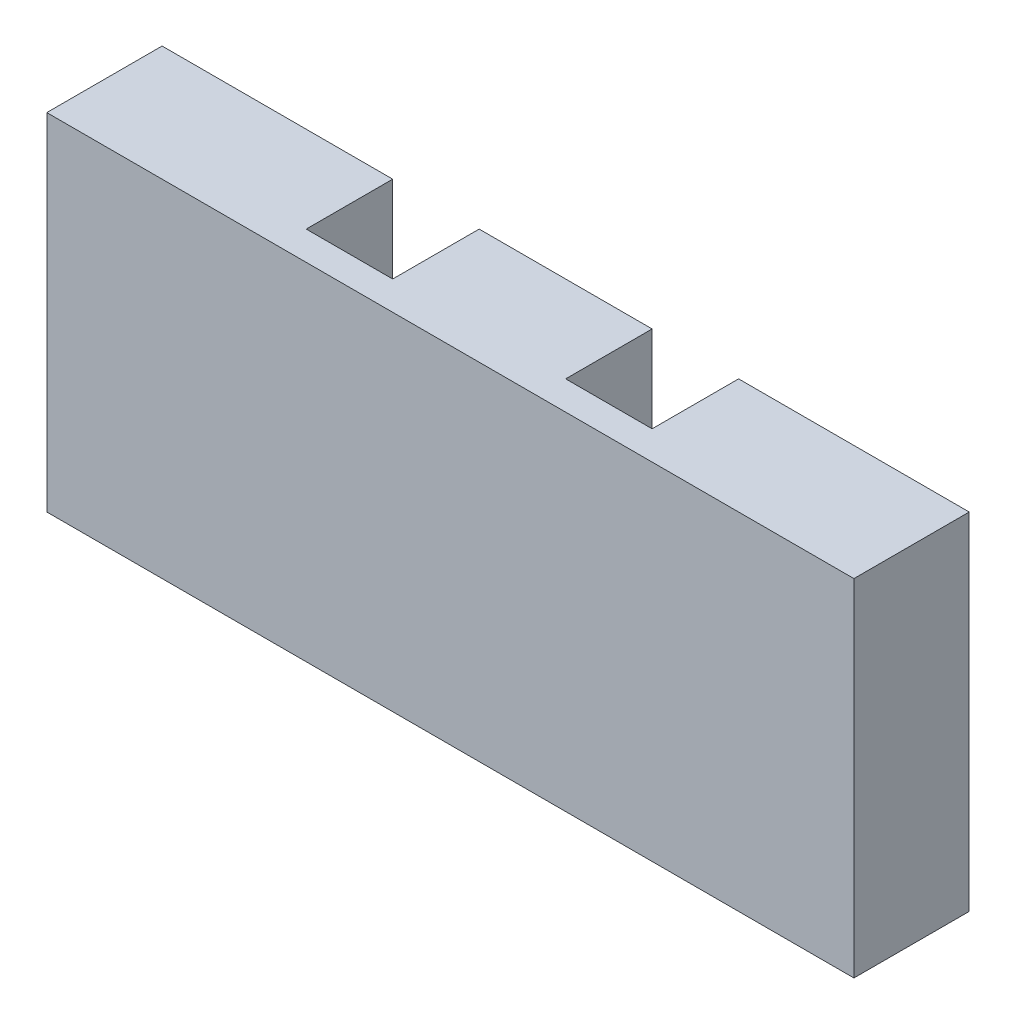
ISO-10303-21;
HEADER;
FILE_DESCRIPTION(('STEP AP214'),'2;1');
FILE_NAME('part.step','',(''),(''),'','','');
FILE_SCHEMA(('AUTOMOTIVE_DESIGN { 1 0 10303 214 1 1 1 1 }'));
ENDSEC;
DATA;
#1=APPLICATION_CONTEXT('core data for automotive mechanical design processes');
#2=APPLICATION_PROTOCOL_DEFINITION('international standard','automotive_design',2000,#1);
#3=PRODUCT_CONTEXT('',#1,'mechanical');
#4=PRODUCT('Part','Part','',(#3));
#5=PRODUCT_RELATED_PRODUCT_CATEGORY('part','',(#4));
#6=PRODUCT_DEFINITION_FORMATION('','',#4);
#7=PRODUCT_DEFINITION_CONTEXT('part definition',#1,'design');
#8=PRODUCT_DEFINITION('design','',#6,#7);
#9=PRODUCT_DEFINITION_SHAPE('','',#8);
#10=(LENGTH_UNIT() NAMED_UNIT(*) SI_UNIT(.MILLI.,.METRE.));
#11=(NAMED_UNIT(*) PLANE_ANGLE_UNIT() SI_UNIT($,.RADIAN.));
#12=(NAMED_UNIT(*) SI_UNIT($,.STERADIAN.) SOLID_ANGLE_UNIT());
#13=UNCERTAINTY_MEASURE_WITH_UNIT(LENGTH_MEASURE(1.E-05),#10,'distance_accuracy_value','');
#14=(GEOMETRIC_REPRESENTATION_CONTEXT(3) GLOBAL_UNCERTAINTY_ASSIGNED_CONTEXT((#13)) GLOBAL_UNIT_ASSIGNED_CONTEXT((#10,
#11,#12)) REPRESENTATION_CONTEXT('',''));
#15=CARTESIAN_POINT('',(0.,0.,0.));
#16=DIRECTION('',(0.,0.,1.));
#17=DIRECTION('',(1.,0.,0.));
#18=AXIS2_PLACEMENT_3D('',#15,#16,#17);
#19=CARTESIAN_POINT('',(0.,0.,0.));
#20=DIRECTION('',(0.,0.,1.));
#21=DIRECTION('',(1.,0.,0.));
#22=AXIS2_PLACEMENT_3D('',#19,#20,#21);
#23=PLANE('',#22);
#24=DIRECTION('',(0.,-1.,0.));
#25=VECTOR('',#24,1.);
#26=CARTESIAN_POINT('',(-60.,60.,0.));
#27=LINE('',#26,#25);
#28=CARTESIAN_POINT('',(-60.,60.,0.));
#29=VERTEX_POINT('',#28);
#30=CARTESIAN_POINT('',(-60.,-60.,0.));
#31=VERTEX_POINT('',#30);
#32=EDGE_CURVE('E136',#29,#31,#27,.T.);
#33=ORIENTED_EDGE('',*,*,#32,.F.);
#34=DIRECTION('',(-1.,0.,0.));
#35=VECTOR('',#34,1.);
#36=CARTESIAN_POINT('',(-140.,60.,0.));
#37=LINE('',#36,#35);
#38=CARTESIAN_POINT('',(-30.,60.,0.));
#39=VERTEX_POINT('',#38);
#40=EDGE_CURVE('E144',#39,#29,#37,.T.);
#41=ORIENTED_EDGE('',*,*,#40,.F.);
#42=DIRECTION('',(0.,1.,0.));
#43=VECTOR('',#42,1.);
#44=CARTESIAN_POINT('',(-30.,10.,0.));
#45=LINE('',#44,#43);
#46=CARTESIAN_POINT('',(-30.,10.,0.));
#47=VERTEX_POINT('',#46);
#48=EDGE_CURVE('E67',#47,#39,#45,.T.);
#49=ORIENTED_EDGE('',*,*,#48,.F.);
#50=DIRECTION('',(-1.,0.,0.));
#51=VECTOR('',#50,1.);
#52=CARTESIAN_POINT('',(30.,10.,0.));
#53=LINE('',#52,#51);
#54=CARTESIAN_POINT('',(30.,10.,0.));
#55=VERTEX_POINT('',#54);
#56=EDGE_CURVE('E223',#55,#47,#53,.T.);
#57=ORIENTED_EDGE('',*,*,#56,.F.);
#58=DIRECTION('',(0.,-1.,0.));
#59=VECTOR('',#58,1.);
#60=CARTESIAN_POINT('',(30.,10.,0.));
#61=LINE('',#60,#59);
#62=CARTESIAN_POINT('',(30.,60.,0.));
#63=VERTEX_POINT('',#62);
#64=EDGE_CURVE('E235',#63,#55,#61,.T.);
#65=ORIENTED_EDGE('',*,*,#64,.F.);
#66=CARTESIAN_POINT('',(60.,60.,0.));
#67=VERTEX_POINT('',#66);
#68=EDGE_CURVE('E156',#67,#63,#37,.T.);
#69=ORIENTED_EDGE('',*,*,#68,.F.);
#70=DIRECTION('',(0.,1.,0.));
#71=VECTOR('',#70,1.);
#72=CARTESIAN_POINT('',(60.,60.,0.));
#73=LINE('',#72,#71);
#74=CARTESIAN_POINT('',(60.,-60.,0.));
#75=VERTEX_POINT('',#74);
#76=EDGE_CURVE('E149',#75,#67,#73,.T.);
#77=ORIENTED_EDGE('',*,*,#76,.F.);
#78=DIRECTION('',(1.,0.,0.));
#79=VECTOR('',#78,1.);
#80=CARTESIAN_POINT('',(-140.,-60.,0.));
#81=LINE('',#80,#79);
#82=EDGE_CURVE('E147',#31,#75,#81,.T.);
#83=ORIENTED_EDGE('',*,*,#82,.F.);
#84=EDGE_LOOP('',(#33,#41,#49,#57,#65,#69,#77,#83));
#85=FACE_BOUND('',#84,.T.);
#86=ADVANCED_FACE('F43',(#85),#23,.F.);
#87=CARTESIAN_POINT('',(140.,60.,10.));
#88=DIRECTION('',(-1.,0.,0.));
#89=DIRECTION('',(0.,-1.,0.));
#90=AXIS2_PLACEMENT_3D('',#87,#88,#89);
#91=PLANE('',#90);
#92=DIRECTION('',(0.,0.,-1.));
#93=VECTOR('',#92,1.);
#94=CARTESIAN_POINT('',(140.,-60.,10.));
#95=LINE('',#94,#93);
#96=CARTESIAN_POINT('',(140.,-60.,10.));
#97=VERTEX_POINT('',#96);
#98=CARTESIAN_POINT('',(140.,-60.,-30.));
#99=VERTEX_POINT('',#98);
#100=EDGE_CURVE('E169',#97,#99,#95,.T.);
#101=ORIENTED_EDGE('',*,*,#100,.T.);
#102=DIRECTION('',(0.,-1.,0.));
#103=VECTOR('',#102,1.);
#104=CARTESIAN_POINT('',(140.,60.,-30.));
#105=LINE('',#104,#103);
#106=CARTESIAN_POINT('',(140.,60.,-30.));
#107=VERTEX_POINT('',#106);
#108=EDGE_CURVE('E194',#107,#99,#105,.T.);
#109=ORIENTED_EDGE('',*,*,#108,.F.);
#110=DIRECTION('',(0.,0.,-1.));
#111=VECTOR('',#110,1.);
#112=CARTESIAN_POINT('',(140.,60.,10.));
#113=LINE('',#112,#111);
#114=CARTESIAN_POINT('',(140.,60.,10.));
#115=VERTEX_POINT('',#114);
#116=EDGE_CURVE('E11',#115,#107,#113,.T.);
#117=ORIENTED_EDGE('',*,*,#116,.F.);
#118=DIRECTION('',(0.,1.,0.));
#119=VECTOR('',#118,1.);
#120=CARTESIAN_POINT('',(140.,60.,10.));
#121=LINE('',#120,#119);
#122=EDGE_CURVE('E168',#97,#115,#121,.T.);
#123=ORIENTED_EDGE('',*,*,#122,.F.);
#124=EDGE_LOOP('',(#101,#109,#117,#123));
#125=FACE_BOUND('',#124,.T.);
#126=ADVANCED_FACE('F45',(#125),#91,.F.);
#127=CARTESIAN_POINT('',(-140.,60.,10.));
#128=DIRECTION('',(0.,-1.,0.));
#129=DIRECTION('',(0.,0.,-1.));
#130=AXIS2_PLACEMENT_3D('',#127,#128,#129);
#131=PLANE('',#130);
#132=ORIENTED_EDGE('',*,*,#116,.T.);
#133=DIRECTION('',(1.,0.,0.));
#134=VECTOR('',#133,1.);
#135=CARTESIAN_POINT('',(140.,60.,-30.));
#136=LINE('',#135,#134);
#137=CARTESIAN_POINT('',(60.,60.,-30.));
#138=VERTEX_POINT('',#137);
#139=EDGE_CURVE('E204',#138,#107,#136,.T.);
#140=ORIENTED_EDGE('',*,*,#139,.F.);
#141=DIRECTION('',(0.,0.,1.));
#142=VECTOR('',#141,1.);
#143=CARTESIAN_POINT('',(60.,60.,-30.));
#144=LINE('',#143,#142);
#145=EDGE_CURVE('E208',#138,#67,#144,.T.);
#146=ORIENTED_EDGE('',*,*,#145,.T.);
#147=ORIENTED_EDGE('',*,*,#68,.T.);
#148=DIRECTION('',(0.,0.,1.));
#149=VECTOR('',#148,1.);
#150=CARTESIAN_POINT('',(30.,60.,-30.));
#151=LINE('',#150,#149);
#152=CARTESIAN_POINT('',(30.,60.,-30.));
#153=VERTEX_POINT('',#152);
#154=EDGE_CURVE('E160',#153,#63,#151,.T.);
#155=ORIENTED_EDGE('',*,*,#154,.F.);
#156=DIRECTION('',(1.,0.,0.));
#157=VECTOR('',#156,1.);
#158=CARTESIAN_POINT('',(30.,60.,-30.));
#159=LINE('',#158,#157);
#160=CARTESIAN_POINT('',(-30.,60.,-30.));
#161=VERTEX_POINT('',#160);
#162=EDGE_CURVE('E222',#161,#153,#159,.T.);
#163=ORIENTED_EDGE('',*,*,#162,.F.);
#164=DIRECTION('',(0.,0.,1.));
#165=VECTOR('',#164,1.);
#166=CARTESIAN_POINT('',(-30.,60.,-30.));
#167=LINE('',#166,#165);
#168=EDGE_CURVE('E154',#161,#39,#167,.T.);
#169=ORIENTED_EDGE('',*,*,#168,.T.);
#170=ORIENTED_EDGE('',*,*,#40,.T.);
#171=DIRECTION('',(0.,0.,1.));
#172=VECTOR('',#171,1.);
#173=CARTESIAN_POINT('',(-60.,60.,-30.));
#174=LINE('',#173,#172);
#175=CARTESIAN_POINT('',(-60.,60.,-30.));
#176=VERTEX_POINT('',#175);
#177=EDGE_CURVE('E133',#176,#29,#174,.T.);
#178=ORIENTED_EDGE('',*,*,#177,.F.);
#179=DIRECTION('',(1.,0.,0.));
#180=VECTOR('',#179,1.);
#181=CARTESIAN_POINT('',(-140.,60.,-30.));
#182=LINE('',#181,#180);
#183=CARTESIAN_POINT('',(-140.,60.,-30.));
#184=VERTEX_POINT('',#183);
#185=EDGE_CURVE('E183',#184,#176,#182,.T.);
#186=ORIENTED_EDGE('',*,*,#185,.F.);
#187=DIRECTION('',(0.,0.,-1.));
#188=VECTOR('',#187,1.);
#189=CARTESIAN_POINT('',(-140.,60.,10.));
#190=LINE('',#189,#188);
#191=CARTESIAN_POINT('',(-140.,60.,10.));
#192=VERTEX_POINT('',#191);
#193=EDGE_CURVE('E52',#192,#184,#190,.T.);
#194=ORIENTED_EDGE('',*,*,#193,.F.);
#195=DIRECTION('',(-1.,0.,0.));
#196=VECTOR('',#195,1.);
#197=CARTESIAN_POINT('',(-140.,60.,10.));
#198=LINE('',#197,#196);
#199=EDGE_CURVE('E254',#115,#192,#198,.T.);
#200=ORIENTED_EDGE('',*,*,#199,.F.);
#201=EDGE_LOOP('',(#132,#140,#146,#147,#155,#163,#169,#170,#178,#186,#194,#200));
#202=FACE_BOUND('',#201,.T.);
#203=ADVANCED_FACE('F152',(#202),#131,.F.);
#204=CARTESIAN_POINT('',(-140.,60.,10.));
#205=DIRECTION('',(1.,0.,0.));
#206=DIRECTION('',(0.,1.,0.));
#207=AXIS2_PLACEMENT_3D('',#204,#205,#206);
#208=PLANE('',#207);
#209=ORIENTED_EDGE('',*,*,#193,.T.);
#210=DIRECTION('',(0.,1.,0.));
#211=VECTOR('',#210,1.);
#212=CARTESIAN_POINT('',(-140.,60.,-30.));
#213=LINE('',#212,#211);
#214=CARTESIAN_POINT('',(-140.,-60.,-30.));
#215=VERTEX_POINT('',#214);
#216=EDGE_CURVE('E150',#215,#184,#213,.T.);
#217=ORIENTED_EDGE('',*,*,#216,.F.);
#218=DIRECTION('',(0.,0.,-1.));
#219=VECTOR('',#218,1.);
#220=CARTESIAN_POINT('',(-140.,-60.,10.));
#221=LINE('',#220,#219);
#222=CARTESIAN_POINT('',(-140.,-60.,10.));
#223=VERTEX_POINT('',#222);
#224=EDGE_CURVE('E172',#223,#215,#221,.T.);
#225=ORIENTED_EDGE('',*,*,#224,.F.);
#226=DIRECTION('',(0.,-1.,0.));
#227=VECTOR('',#226,1.);
#228=CARTESIAN_POINT('',(-140.,60.,10.));
#229=LINE('',#228,#227);
#230=EDGE_CURVE('E182',#192,#223,#229,.T.);
#231=ORIENTED_EDGE('',*,*,#230,.F.);
#232=EDGE_LOOP('',(#209,#217,#225,#231));
#233=FACE_BOUND('',#232,.T.);
#234=ADVANCED_FACE('F179',(#233),#208,.F.);
#235=CARTESIAN_POINT('',(-140.,-60.,10.));
#236=DIRECTION('',(0.,1.,0.));
#237=DIRECTION('',(0.,0.,1.));
#238=AXIS2_PLACEMENT_3D('',#235,#236,#237);
#239=PLANE('',#238);
#240=ORIENTED_EDGE('',*,*,#224,.T.);
#241=DIRECTION('',(-1.,0.,0.));
#242=VECTOR('',#241,1.);
#243=CARTESIAN_POINT('',(-140.,-60.,-30.));
#244=LINE('',#243,#242);
#245=CARTESIAN_POINT('',(-60.0000000000001,-60.,-30.));
#246=VERTEX_POINT('',#245);
#247=EDGE_CURVE('E189',#246,#215,#244,.T.);
#248=ORIENTED_EDGE('',*,*,#247,.F.);
#249=DIRECTION('',(0.,0.,1.));
#250=VECTOR('',#249,1.);
#251=CARTESIAN_POINT('',(-60.0000000000001,-60.,-30.));
#252=LINE('',#251,#250);
#253=EDGE_CURVE('E59',#246,#31,#252,.T.);
#254=ORIENTED_EDGE('',*,*,#253,.T.);
#255=ORIENTED_EDGE('',*,*,#82,.T.);
#256=DIRECTION('',(0.,0.,1.));
#257=VECTOR('',#256,1.);
#258=CARTESIAN_POINT('',(60.,-60.,-30.));
#259=LINE('',#258,#257);
#260=CARTESIAN_POINT('',(60.,-60.,-30.));
#261=VERTEX_POINT('',#260);
#262=EDGE_CURVE('E214',#261,#75,#259,.T.);
#263=ORIENTED_EDGE('',*,*,#262,.F.);
#264=DIRECTION('',(-1.,0.,0.));
#265=VECTOR('',#264,1.);
#266=CARTESIAN_POINT('',(140.,-60.,-30.));
#267=LINE('',#266,#265);
#268=EDGE_CURVE('E198',#99,#261,#267,.T.);
#269=ORIENTED_EDGE('',*,*,#268,.F.);
#270=ORIENTED_EDGE('',*,*,#100,.F.);
#271=DIRECTION('',(1.,0.,0.));
#272=VECTOR('',#271,1.);
#273=CARTESIAN_POINT('',(-140.,-60.,10.));
#274=LINE('',#273,#272);
#275=EDGE_CURVE('E164',#223,#97,#274,.T.);
#276=ORIENTED_EDGE('',*,*,#275,.F.);
#277=EDGE_LOOP('',(#240,#248,#254,#255,#263,#269,#270,#276));
#278=FACE_BOUND('',#277,.T.);
#279=ADVANCED_FACE('F265',(#278),#239,.F.);
#280=CARTESIAN_POINT('',(0.,0.,10.));
#281=DIRECTION('',(0.,0.,1.));
#282=DIRECTION('',(1.,0.,0.));
#283=AXIS2_PLACEMENT_3D('',#280,#281,#282);
#284=PLANE('',#283);
#285=ORIENTED_EDGE('',*,*,#122,.T.);
#286=ORIENTED_EDGE('',*,*,#199,.T.);
#287=ORIENTED_EDGE('',*,*,#230,.T.);
#288=ORIENTED_EDGE('',*,*,#275,.T.);
#289=EDGE_LOOP('',(#285,#286,#287,#288));
#290=FACE_BOUND('',#289,.T.);
#291=ADVANCED_FACE('F261',(#290),#284,.T.);
#292=CARTESIAN_POINT('',(-30.,10.,-30.));
#293=DIRECTION('',(1.,0.,0.));
#294=DIRECTION('',(0.,0.,-1.));
#295=AXIS2_PLACEMENT_3D('',#292,#293,#294);
#296=PLANE('',#295);
#297=ORIENTED_EDGE('',*,*,#48,.T.);
#298=ORIENTED_EDGE('',*,*,#168,.F.);
#299=DIRECTION('',(0.,1.,0.));
#300=VECTOR('',#299,1.);
#301=CARTESIAN_POINT('',(-30.,10.,-30.));
#302=LINE('',#301,#300);
#303=CARTESIAN_POINT('',(-30.,10.,-30.));
#304=VERTEX_POINT('',#303);
#305=EDGE_CURVE('E218',#304,#161,#302,.T.);
#306=ORIENTED_EDGE('',*,*,#305,.F.);
#307=DIRECTION('',(0.,0.,1.));
#308=VECTOR('',#307,1.);
#309=CARTESIAN_POINT('',(-30.,10.,-30.));
#310=LINE('',#309,#308);
#311=EDGE_CURVE('E232',#304,#47,#310,.T.);
#312=ORIENTED_EDGE('',*,*,#311,.T.);
#313=EDGE_LOOP('',(#297,#298,#306,#312));
#314=FACE_BOUND('',#313,.T.);
#315=ADVANCED_FACE('F289',(#314),#296,.F.);
#316=CARTESIAN_POINT('',(30.,10.,-30.));
#317=DIRECTION('',(-1.,0.,0.));
#318=DIRECTION('',(0.,0.,1.));
#319=AXIS2_PLACEMENT_3D('',#316,#317,#318);
#320=PLANE('',#319);
#321=ORIENTED_EDGE('',*,*,#64,.T.);
#322=DIRECTION('',(0.,0.,1.));
#323=VECTOR('',#322,1.);
#324=CARTESIAN_POINT('',(30.,10.,-30.));
#325=LINE('',#324,#323);
#326=CARTESIAN_POINT('',(30.,10.,-30.));
#327=VERTEX_POINT('',#326);
#328=EDGE_CURVE('E244',#327,#55,#325,.T.);
#329=ORIENTED_EDGE('',*,*,#328,.F.);
#330=DIRECTION('',(0.,-1.,0.));
#331=VECTOR('',#330,1.);
#332=CARTESIAN_POINT('',(30.,10.,-30.));
#333=LINE('',#332,#331);
#334=EDGE_CURVE('E226',#153,#327,#333,.T.);
#335=ORIENTED_EDGE('',*,*,#334,.F.);
#336=ORIENTED_EDGE('',*,*,#154,.T.);
#337=EDGE_LOOP('',(#321,#329,#335,#336));
#338=FACE_BOUND('',#337,.T.);
#339=ADVANCED_FACE('F282',(#338),#320,.F.);
#340=CARTESIAN_POINT('',(30.,10.,-30.));
#341=DIRECTION('',(0.,1.,0.));
#342=DIRECTION('',(0.,0.,1.));
#343=AXIS2_PLACEMENT_3D('',#340,#341,#342);
#344=PLANE('',#343);
#345=ORIENTED_EDGE('',*,*,#56,.T.);
#346=ORIENTED_EDGE('',*,*,#311,.F.);
#347=DIRECTION('',(-1.,0.,0.));
#348=VECTOR('',#347,1.);
#349=CARTESIAN_POINT('',(30.,10.,-30.));
#350=LINE('',#349,#348);
#351=EDGE_CURVE('E229',#327,#304,#350,.T.);
#352=ORIENTED_EDGE('',*,*,#351,.F.);
#353=ORIENTED_EDGE('',*,*,#328,.T.);
#354=EDGE_LOOP('',(#345,#346,#352,#353));
#355=FACE_BOUND('',#354,.T.);
#356=ADVANCED_FACE('F291',(#355),#344,.F.);
#357=CARTESIAN_POINT('',(0.,0.,-30.));
#358=DIRECTION('',(0.,0.,1.));
#359=DIRECTION('',(1.,0.,0.));
#360=AXIS2_PLACEMENT_3D('',#357,#358,#359);
#361=PLANE('',#360);
#362=ORIENTED_EDGE('',*,*,#305,.T.);
#363=ORIENTED_EDGE('',*,*,#162,.T.);
#364=ORIENTED_EDGE('',*,*,#334,.T.);
#365=ORIENTED_EDGE('',*,*,#351,.T.);
#366=EDGE_LOOP('',(#362,#363,#364,#365));
#367=FACE_BOUND('',#366,.T.);
#368=ADVANCED_FACE('F285',(#367),#361,.F.);
#369=CARTESIAN_POINT('',(60.,60.,-30.));
#370=DIRECTION('',(1.,0.,0.));
#371=DIRECTION('',(0.,1.,0.));
#372=AXIS2_PLACEMENT_3D('',#369,#370,#371);
#373=PLANE('',#372);
#374=ORIENTED_EDGE('',*,*,#76,.T.);
#375=ORIENTED_EDGE('',*,*,#145,.F.);
#376=DIRECTION('',(0.,1.,0.));
#377=VECTOR('',#376,1.);
#378=CARTESIAN_POINT('',(60.,60.,-30.));
#379=LINE('',#378,#377);
#380=EDGE_CURVE('E201',#261,#138,#379,.T.);
#381=ORIENTED_EDGE('',*,*,#380,.F.);
#382=ORIENTED_EDGE('',*,*,#262,.T.);
#383=EDGE_LOOP('',(#374,#375,#381,#382));
#384=FACE_BOUND('',#383,.T.);
#385=ADVANCED_FACE('F275',(#384),#373,.F.);
#386=CARTESIAN_POINT('',(0.,0.,-30.));
#387=DIRECTION('',(0.,0.,-1.));
#388=DIRECTION('',(-1.,0.,0.));
#389=AXIS2_PLACEMENT_3D('',#386,#387,#388);
#390=PLANE('',#389);
#391=ORIENTED_EDGE('',*,*,#108,.T.);
#392=ORIENTED_EDGE('',*,*,#268,.T.);
#393=ORIENTED_EDGE('',*,*,#380,.T.);
#394=ORIENTED_EDGE('',*,*,#139,.T.);
#395=EDGE_LOOP('',(#391,#392,#393,#394));
#396=FACE_BOUND('',#395,.T.);
#397=ADVANCED_FACE('F271',(#396),#390,.T.);
#398=CARTESIAN_POINT('',(-60.,60.,-30.));
#399=DIRECTION('',(-1.,0.,0.));
#400=DIRECTION('',(0.,-1.,0.));
#401=AXIS2_PLACEMENT_3D('',#398,#399,#400);
#402=PLANE('',#401);
#403=ORIENTED_EDGE('',*,*,#32,.T.);
#404=ORIENTED_EDGE('',*,*,#253,.F.);
#405=DIRECTION('',(0.,-1.,0.));
#406=VECTOR('',#405,1.);
#407=CARTESIAN_POINT('',(-60.,60.,-30.));
#408=LINE('',#407,#406);
#409=EDGE_CURVE('E138',#176,#246,#408,.T.);
#410=ORIENTED_EDGE('',*,*,#409,.F.);
#411=ORIENTED_EDGE('',*,*,#177,.T.);
#412=EDGE_LOOP('',(#403,#404,#410,#411));
#413=FACE_BOUND('',#412,.T.);
#414=ADVANCED_FACE('F135',(#413),#402,.F.);
#415=CARTESIAN_POINT('',(0.,0.,-30.));
#416=DIRECTION('',(0.,0.,1.));
#417=DIRECTION('',(1.,0.,0.));
#418=AXIS2_PLACEMENT_3D('',#415,#416,#417);
#419=PLANE('',#418);
#420=ORIENTED_EDGE('',*,*,#216,.T.);
#421=ORIENTED_EDGE('',*,*,#185,.T.);
#422=ORIENTED_EDGE('',*,*,#409,.T.);
#423=ORIENTED_EDGE('',*,*,#247,.T.);
#424=EDGE_LOOP('',(#420,#421,#422,#423));
#425=FACE_BOUND('',#424,.T.);
#426=ADVANCED_FACE('F188',(#425),#419,.F.);
#427=CLOSED_SHELL('',(#86,#126,#203,#234,#279,#291,#315,#339,#356,#368,#385,#397,#414,#426));
#428=MANIFOLD_SOLID_BREP('B2',#427);
#429=ADVANCED_BREP_SHAPE_REPRESENTATION('',(#18,#428),#14);
#430=SHAPE_DEFINITION_REPRESENTATION(#9,#429);
ENDSEC;
END-ISO-10303-21;
